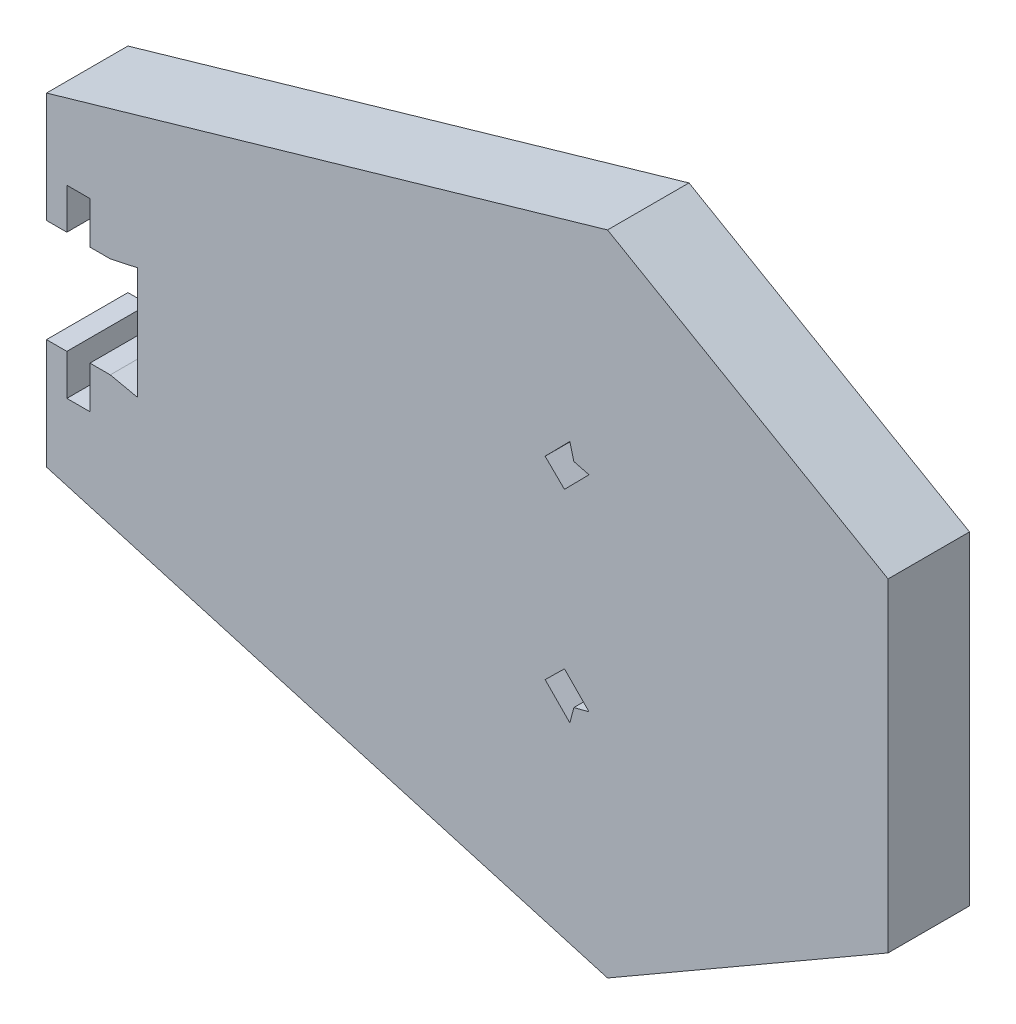
ISO-10303-21;
HEADER;
FILE_DESCRIPTION(('STEP AP214'),'2;1');
FILE_NAME('part.step','',(''),(''),'','','');
FILE_SCHEMA(('AUTOMOTIVE_DESIGN { 1 0 10303 214 1 1 1 1 }'));
ENDSEC;
DATA;
#1=APPLICATION_CONTEXT('core data for automotive mechanical design processes');
#2=APPLICATION_PROTOCOL_DEFINITION('international standard','automotive_design',2000,#1);
#3=PRODUCT_CONTEXT('',#1,'mechanical');
#4=PRODUCT('Part','Part','',(#3));
#5=PRODUCT_RELATED_PRODUCT_CATEGORY('part','',(#4));
#6=PRODUCT_DEFINITION_FORMATION('','',#4);
#7=PRODUCT_DEFINITION_CONTEXT('part definition',#1,'design');
#8=PRODUCT_DEFINITION('design','',#6,#7);
#9=PRODUCT_DEFINITION_SHAPE('','',#8);
#10=(LENGTH_UNIT() NAMED_UNIT(*) SI_UNIT(.MILLI.,.METRE.));
#11=(NAMED_UNIT(*) PLANE_ANGLE_UNIT() SI_UNIT($,.RADIAN.));
#12=(NAMED_UNIT(*) SI_UNIT($,.STERADIAN.) SOLID_ANGLE_UNIT());
#13=UNCERTAINTY_MEASURE_WITH_UNIT(LENGTH_MEASURE(1.E-05),#10,'distance_accuracy_value','');
#14=(GEOMETRIC_REPRESENTATION_CONTEXT(3) GLOBAL_UNCERTAINTY_ASSIGNED_CONTEXT((#13)) GLOBAL_UNIT_ASSIGNED_CONTEXT((#10,
#11,#12)) REPRESENTATION_CONTEXT('',''));
#15=CARTESIAN_POINT('',(0.,0.,0.));
#16=DIRECTION('',(0.,0.,1.));
#17=DIRECTION('',(1.,0.,0.));
#18=AXIS2_PLACEMENT_3D('',#15,#16,#17);
#19=CARTESIAN_POINT('',(-3.26682362399667,3.21868149985037,6.));
#20=DIRECTION('',(0.712336033670005,-0.701838567717168,0.));
#21=DIRECTION('',(0.701838567717168,0.712336033670005,0.));
#22=AXIS2_PLACEMENT_3D('',#19,#20,#21);
#23=PLANE('',#22);
#24=DIRECTION('',(-0.701838567717168,-0.712336033670005,0.));
#25=VECTOR('',#24,1.);
#26=CARTESIAN_POINT('',(-3.26682362399667,3.21868149985037,0.));
#27=LINE('',#26,#25);
#28=CARTESIAN_POINT('',(2.4087145761827,8.97910926261704,0.));
#29=VERTEX_POINT('',#28);
#30=CARTESIAN_POINT('',(0.584447895170022,7.12755685201684,0.));
#31=VERTEX_POINT('',#30);
#32=EDGE_CURVE('E399',#29,#31,#27,.T.);
#33=ORIENTED_EDGE('',*,*,#32,.F.);
#34=DIRECTION('',(0.,0.,-1.));
#35=VECTOR('',#34,1.);
#36=CARTESIAN_POINT('',(2.4087145761827,8.97910926261704,6.));
#37=LINE('',#36,#35);
#38=CARTESIAN_POINT('',(2.4087145761827,8.97910926261704,6.));
#39=VERTEX_POINT('',#38);
#40=EDGE_CURVE('E422',#39,#29,#37,.T.);
#41=ORIENTED_EDGE('',*,*,#40,.F.);
#42=DIRECTION('',(-0.701838567717168,-0.712336033670005,0.));
#43=VECTOR('',#42,1.);
#44=CARTESIAN_POINT('',(-3.26682362399667,3.21868149985037,6.));
#45=LINE('',#44,#43);
#46=CARTESIAN_POINT('',(0.584447895170022,7.12755685201684,6.));
#47=VERTEX_POINT('',#46);
#48=EDGE_CURVE('E343',#39,#47,#45,.T.);
#49=ORIENTED_EDGE('',*,*,#48,.T.);
#50=DIRECTION('',(0.,0.,-1.));
#51=VECTOR('',#50,1.);
#52=CARTESIAN_POINT('',(0.584447895170022,7.12755685201684,6.));
#53=LINE('',#52,#51);
#54=EDGE_CURVE('E413',#47,#31,#53,.T.);
#55=ORIENTED_EDGE('',*,*,#54,.T.);
#56=EDGE_LOOP('',(#33,#41,#49,#55));
#57=FACE_BOUND('',#56,.T.);
#58=ADVANCED_FACE('F35',(#57),#23,.T.);
#59=CARTESIAN_POINT('',(4.43325491605289,1.14578469708355,6.));
#60=DIRECTION('',(-0.968186432146917,-0.250229959450548,0.));
#61=DIRECTION('',(0.250229959450548,-0.968186432146917,0.));
#62=AXIS2_PLACEMENT_3D('',#59,#60,#61);
#63=PLANE('',#62);
#64=DIRECTION('',(-0.250229959450548,0.968186432146917,0.));
#65=VECTOR('',#64,1.);
#66=CARTESIAN_POINT('',(4.43325491605289,1.14578469708355,0.));
#67=LINE('',#66,#65);
#68=CARTESIAN_POINT('',(2.7004254455055,7.85042544550625,0.));
#69=VERTEX_POINT('',#68);
#70=EDGE_CURVE('E402',#69,#29,#67,.T.);
#71=ORIENTED_EDGE('',*,*,#70,.F.);
#72=DIRECTION('',(0.,0.,-1.));
#73=VECTOR('',#72,1.);
#74=CARTESIAN_POINT('',(2.7004254455055,7.85042544550625,6.));
#75=LINE('',#74,#73);
#76=CARTESIAN_POINT('',(2.7004254455055,7.85042544550625,6.));
#77=VERTEX_POINT('',#76);
#78=EDGE_CURVE('E420',#77,#69,#75,.T.);
#79=ORIENTED_EDGE('',*,*,#78,.F.);
#80=DIRECTION('',(-0.250229959450548,0.968186432146917,0.));
#81=VECTOR('',#80,1.);
#82=CARTESIAN_POINT('',(4.43325491605289,1.14578469708355,6.));
#83=LINE('',#82,#81);
#84=EDGE_CURVE('E346',#77,#39,#83,.T.);
#85=ORIENTED_EDGE('',*,*,#84,.T.);
#86=ORIENTED_EDGE('',*,*,#40,.T.);
#87=EDGE_LOOP('',(#71,#79,#85,#86));
#88=FACE_BOUND('',#87,.T.);
#89=ADVANCED_FACE('F546',(#88),#63,.T.);
#90=CARTESIAN_POINT('',(2.07100392519156,8.01310085209733,6.));
#91=DIRECTION('',(-0.250229959450549,-0.968186432146917,0.));
#92=DIRECTION('',(0.968186432146917,-0.250229959450549,0.));
#93=AXIS2_PLACEMENT_3D('',#90,#91,#92);
#94=PLANE('',#93);
#95=DIRECTION('',(-0.968186432146917,0.250229959450549,0.));
#96=VECTOR('',#95,1.);
#97=CARTESIAN_POINT('',(2.07100392519156,8.01310085209733,0.));
#98=LINE('',#97,#96);
#99=CARTESIAN_POINT('',(3.81927842247489,7.56125537891345,0.));
#100=VERTEX_POINT('',#99);
#101=EDGE_CURVE('E405',#100,#69,#98,.T.);
#102=ORIENTED_EDGE('',*,*,#101,.F.);
#103=DIRECTION('',(0.,0.,-1.));
#104=VECTOR('',#103,1.);
#105=CARTESIAN_POINT('',(3.81927842247489,7.56125537891345,6.));
#106=LINE('',#105,#104);
#107=CARTESIAN_POINT('',(3.81927842247489,7.56125537891345,6.));
#108=VERTEX_POINT('',#107);
#109=EDGE_CURVE('E418',#108,#100,#106,.T.);
#110=ORIENTED_EDGE('',*,*,#109,.F.);
#111=DIRECTION('',(-0.968186432146917,0.250229959450549,0.));
#112=VECTOR('',#111,1.);
#113=CARTESIAN_POINT('',(2.07100392519156,8.01310085209733,6.));
#114=LINE('',#113,#112);
#115=EDGE_CURVE('E349',#108,#77,#114,.T.);
#116=ORIENTED_EDGE('',*,*,#115,.T.);
#117=ORIENTED_EDGE('',*,*,#78,.T.);
#118=EDGE_LOOP('',(#102,#110,#116,#117));
#119=FACE_BOUND('',#118,.T.);
#120=ADVANCED_FACE('F552',(#119),#94,.T.);
#121=CARTESIAN_POINT('',(-1.84222279419438,1.81507455214917,6.));
#122=DIRECTION('',(-0.712336033670005,0.701838567717168,0.));
#123=DIRECTION('',(-0.701838567717168,-0.712336033670005,0.));
#124=AXIS2_PLACEMENT_3D('',#121,#122,#123);
#125=PLANE('',#124);
#126=DIRECTION('',(0.701838567717168,0.712336033670005,0.));
#127=VECTOR('',#126,1.);
#128=CARTESIAN_POINT('',(-1.84222279419438,1.81507455214917,0.));
#129=LINE('',#128,#127);
#130=CARTESIAN_POINT('',(2.00904872497232,5.72394990431564,0.));
#131=VERTEX_POINT('',#130);
#132=EDGE_CURVE('E408',#131,#100,#129,.T.);
#133=ORIENTED_EDGE('',*,*,#132,.F.);
#134=DIRECTION('',(0.,0.,-1.));
#135=VECTOR('',#134,1.);
#136=CARTESIAN_POINT('',(2.00904872497232,5.72394990431564,6.));
#137=LINE('',#136,#135);
#138=CARTESIAN_POINT('',(2.00904872497232,5.72394990431564,6.));
#139=VERTEX_POINT('',#138);
#140=EDGE_CURVE('E415',#139,#131,#137,.T.);
#141=ORIENTED_EDGE('',*,*,#140,.F.);
#142=DIRECTION('',(0.701838567717168,0.712336033670005,0.));
#143=VECTOR('',#142,1.);
#144=CARTESIAN_POINT('',(-1.84222279419438,1.81507455214917,6.));
#145=LINE('',#144,#143);
#146=EDGE_CURVE('E352',#139,#108,#145,.T.);
#147=ORIENTED_EDGE('',*,*,#146,.T.);
#148=ORIENTED_EDGE('',*,*,#109,.T.);
#149=EDGE_LOOP('',(#133,#141,#147,#148));
#150=FACE_BOUND('',#149,.T.);
#151=ADVANCED_FACE('F577',(#150),#125,.T.);
#152=CARTESIAN_POINT('',(2.07100392519156,-8.01310085209733,6.));
#153=DIRECTION('',(0.250229959450549,-0.968186432146917,0.));
#154=DIRECTION('',(0.968186432146917,0.250229959450549,0.));
#155=AXIS2_PLACEMENT_3D('',#152,#153,#154);
#156=PLANE('',#155);
#157=DIRECTION('',(-0.968186432146917,-0.250229959450549,0.));
#158=VECTOR('',#157,1.);
#159=CARTESIAN_POINT('',(2.07100392519156,-8.01310085209733,0.));
#160=LINE('',#159,#158);
#161=CARTESIAN_POINT('',(3.81927842247489,-7.56125537891345,0.));
#162=VERTEX_POINT('',#161);
#163=CARTESIAN_POINT('',(2.7004254455055,-7.85042544550625,0.));
#164=VERTEX_POINT('',#163);
#165=EDGE_CURVE('E388',#162,#164,#160,.T.);
#166=ORIENTED_EDGE('',*,*,#165,.T.);
#167=DIRECTION('',(0.,0.,-1.));
#168=VECTOR('',#167,1.);
#169=CARTESIAN_POINT('',(2.7004254455055,-7.85042544550625,6.));
#170=LINE('',#169,#168);
#171=CARTESIAN_POINT('',(2.7004254455055,-7.85042544550625,6.));
#172=VERTEX_POINT('',#171);
#173=EDGE_CURVE('E416',#172,#164,#170,.T.);
#174=ORIENTED_EDGE('',*,*,#173,.F.);
#175=DIRECTION('',(-0.968186432146917,-0.250229959450549,0.));
#176=VECTOR('',#175,1.);
#177=CARTESIAN_POINT('',(2.07100392519156,-8.01310085209733,6.));
#178=LINE('',#177,#176);
#179=CARTESIAN_POINT('',(3.81927842247489,-7.56125537891345,6.));
#180=VERTEX_POINT('',#179);
#181=EDGE_CURVE('E332',#180,#172,#178,.T.);
#182=ORIENTED_EDGE('',*,*,#181,.F.);
#183=DIRECTION('',(0.,0.,-1.));
#184=VECTOR('',#183,1.);
#185=CARTESIAN_POINT('',(3.81927842247489,-7.56125537891345,6.));
#186=LINE('',#185,#184);
#187=EDGE_CURVE('E424',#180,#162,#186,.T.);
#188=ORIENTED_EDGE('',*,*,#187,.T.);
#189=EDGE_LOOP('',(#166,#174,#182,#188));
#190=FACE_BOUND('',#189,.T.);
#191=ADVANCED_FACE('F573',(#190),#156,.F.);
#192=CARTESIAN_POINT('',(4.43325491605289,-1.14578469708355,6.));
#193=DIRECTION('',(0.968186432146917,-0.250229959450548,0.));
#194=DIRECTION('',(0.250229959450548,0.968186432146917,0.));
#195=AXIS2_PLACEMENT_3D('',#192,#193,#194);
#196=PLANE('',#195);
#197=DIRECTION('',(-0.250229959450548,-0.968186432146917,0.));
#198=VECTOR('',#197,1.);
#199=CARTESIAN_POINT('',(4.43325491605289,-1.14578469708355,0.));
#200=LINE('',#199,#198);
#201=CARTESIAN_POINT('',(2.4087145761827,-8.97910926261704,0.));
#202=VERTEX_POINT('',#201);
#203=EDGE_CURVE('E391',#164,#202,#200,.T.);
#204=ORIENTED_EDGE('',*,*,#203,.T.);
#205=DIRECTION('',(0.,0.,-1.));
#206=VECTOR('',#205,1.);
#207=CARTESIAN_POINT('',(2.4087145761827,-8.97910926261704,6.));
#208=LINE('',#207,#206);
#209=CARTESIAN_POINT('',(2.4087145761827,-8.97910926261704,6.));
#210=VERTEX_POINT('',#209);
#211=EDGE_CURVE('E434',#210,#202,#208,.T.);
#212=ORIENTED_EDGE('',*,*,#211,.F.);
#213=DIRECTION('',(-0.250229959450548,-0.968186432146917,0.));
#214=VECTOR('',#213,1.);
#215=CARTESIAN_POINT('',(4.43325491605289,-1.14578469708355,6.));
#216=LINE('',#215,#214);
#217=EDGE_CURVE('E335',#172,#210,#216,.T.);
#218=ORIENTED_EDGE('',*,*,#217,.F.);
#219=ORIENTED_EDGE('',*,*,#173,.T.);
#220=EDGE_LOOP('',(#204,#212,#218,#219));
#221=FACE_BOUND('',#220,.T.);
#222=ADVANCED_FACE('F569',(#221),#196,.F.);
#223=CARTESIAN_POINT('',(-3.26682362399667,-3.21868149985037,6.));
#224=DIRECTION('',(-0.712336033670005,-0.701838567717168,0.));
#225=DIRECTION('',(0.701838567717168,-0.712336033670005,0.));
#226=AXIS2_PLACEMENT_3D('',#223,#224,#225);
#227=PLANE('',#226);
#228=DIRECTION('',(-0.701838567717168,0.712336033670005,0.));
#229=VECTOR('',#228,1.);
#230=CARTESIAN_POINT('',(-3.26682362399667,-3.21868149985037,0.));
#231=LINE('',#230,#229);
#232=CARTESIAN_POINT('',(0.584447895170024,-7.12755685201684,0.));
#233=VERTEX_POINT('',#232);
#234=EDGE_CURVE('E393',#202,#233,#231,.T.);
#235=ORIENTED_EDGE('',*,*,#234,.T.);
#236=DIRECTION('',(0.,0.,-1.));
#237=VECTOR('',#236,1.);
#238=CARTESIAN_POINT('',(0.584447895170024,-7.12755685201684,6.));
#239=LINE('',#238,#237);
#240=CARTESIAN_POINT('',(0.584447895170024,-7.12755685201684,6.));
#241=VERTEX_POINT('',#240);
#242=EDGE_CURVE('E431',#241,#233,#239,.T.);
#243=ORIENTED_EDGE('',*,*,#242,.F.);
#244=DIRECTION('',(-0.701838567717168,0.712336033670005,0.));
#245=VECTOR('',#244,1.);
#246=CARTESIAN_POINT('',(-3.26682362399667,-3.21868149985037,6.));
#247=LINE('',#246,#245);
#248=EDGE_CURVE('E337',#210,#241,#247,.T.);
#249=ORIENTED_EDGE('',*,*,#248,.F.);
#250=ORIENTED_EDGE('',*,*,#211,.T.);
#251=EDGE_LOOP('',(#235,#243,#249,#250));
#252=FACE_BOUND('',#251,.T.);
#253=ADVANCED_FACE('F565',(#252),#227,.F.);
#254=CARTESIAN_POINT('',(3.8512715191667,-3.90887535216647,6.));
#255=DIRECTION('',(-0.701838567717168,0.712336033670004,0.));
#256=DIRECTION('',(-0.712336033670004,-0.701838567717168,0.));
#257=AXIS2_PLACEMENT_3D('',#254,#255,#256);
#258=PLANE('',#257);
#259=DIRECTION('',(0.712336033670004,0.701838567717168,0.));
#260=VECTOR('',#259,1.);
#261=CARTESIAN_POINT('',(3.8512715191667,-3.90887535216647,0.));
#262=LINE('',#261,#260);
#263=CARTESIAN_POINT('',(2.00904872497232,-5.72394990431564,0.));
#264=VERTEX_POINT('',#263);
#265=EDGE_CURVE('E395',#233,#264,#262,.T.);
#266=ORIENTED_EDGE('',*,*,#265,.T.);
#267=DIRECTION('',(0.,0.,-1.));
#268=VECTOR('',#267,1.);
#269=CARTESIAN_POINT('',(2.00904872497232,-5.72394990431564,6.));
#270=LINE('',#269,#268);
#271=CARTESIAN_POINT('',(2.00904872497232,-5.72394990431564,6.));
#272=VERTEX_POINT('',#271);
#273=EDGE_CURVE('E427',#272,#264,#270,.T.);
#274=ORIENTED_EDGE('',*,*,#273,.F.);
#275=DIRECTION('',(0.712336033670004,0.701838567717168,0.));
#276=VECTOR('',#275,1.);
#277=CARTESIAN_POINT('',(3.8512715191667,-3.90887535216647,6.));
#278=LINE('',#277,#276);
#279=EDGE_CURVE('E339',#241,#272,#278,.T.);
#280=ORIENTED_EDGE('',*,*,#279,.F.);
#281=ORIENTED_EDGE('',*,*,#242,.T.);
#282=EDGE_LOOP('',(#266,#274,#280,#281));
#283=FACE_BOUND('',#282,.T.);
#284=ADVANCED_FACE('F562',(#283),#258,.F.);
#285=CARTESIAN_POINT('',(25.8499999999996,0.,6.));
#286=DIRECTION('',(-1.,0.,0.));
#287=DIRECTION('',(0.,0.,1.));
#288=AXIS2_PLACEMENT_3D('',#285,#286,#287);
#289=PLANE('',#288);
#290=DIRECTION('',(0.,1.,0.));
#291=VECTOR('',#290,1.);
#292=CARTESIAN_POINT('',(25.8499999999996,0.,0.));
#293=LINE('',#292,#291);
#294=CARTESIAN_POINT('',(25.8499999999996,-11.9319055632524,0.));
#295=VERTEX_POINT('',#294);
#296=CARTESIAN_POINT('',(25.8499999999996,11.9319055632521,0.));
#297=VERTEX_POINT('',#296);
#298=EDGE_CURVE('E301',#295,#297,#293,.T.);
#299=ORIENTED_EDGE('',*,*,#298,.T.);
#300=DIRECTION('',(0.,0.,-1.));
#301=VECTOR('',#300,1.);
#302=CARTESIAN_POINT('',(25.8499999999996,11.9319055632521,6.));
#303=LINE('',#302,#301);
#304=CARTESIAN_POINT('',(25.8499999999996,11.9319055632521,6.));
#305=VERTEX_POINT('',#304);
#306=EDGE_CURVE('E428',#305,#297,#303,.T.);
#307=ORIENTED_EDGE('',*,*,#306,.F.);
#308=DIRECTION('',(0.,1.,0.));
#309=VECTOR('',#308,1.);
#310=CARTESIAN_POINT('',(25.8499999999996,0.,6.));
#311=LINE('',#310,#309);
#312=CARTESIAN_POINT('',(25.8499999999996,-11.9319055632524,6.));
#313=VERTEX_POINT('',#312);
#314=EDGE_CURVE('E302',#313,#305,#311,.T.);
#315=ORIENTED_EDGE('',*,*,#314,.F.);
#316=DIRECTION('',(0.,0.,-1.));
#317=VECTOR('',#316,1.);
#318=CARTESIAN_POINT('',(25.8499999999996,-11.9319055632524,6.));
#319=LINE('',#318,#317);
#320=EDGE_CURVE('E358',#313,#295,#319,.T.);
#321=ORIENTED_EDGE('',*,*,#320,.T.);
#322=EDGE_LOOP('',(#299,#307,#315,#321));
#323=FACE_BOUND('',#322,.T.);
#324=ADVANCED_FACE('F37',(#323),#289,.F.);
#325=CARTESIAN_POINT('',(11.6291666666665,20.1423075163528,6.));
#326=DIRECTION('',(-0.500000000000001,-0.866025403784438,0.));
#327=DIRECTION('',(0.866025403784438,-0.500000000000001,0.));
#328=AXIS2_PLACEMENT_3D('',#325,#326,#327);
#329=PLANE('',#328);
#330=DIRECTION('',(-0.866025403784438,0.500000000000001,0.));
#331=VECTOR('',#330,1.);
#332=CARTESIAN_POINT('',(11.6291666666665,20.1423075163528,0.));
#333=LINE('',#332,#331);
#334=CARTESIAN_POINT('',(5.18333333333297,23.8638111265044,0.));
#335=VERTEX_POINT('',#334);
#336=EDGE_CURVE('E361',#297,#335,#333,.T.);
#337=ORIENTED_EDGE('',*,*,#336,.T.);
#338=DIRECTION('',(0.,0.,-1.));
#339=VECTOR('',#338,1.);
#340=CARTESIAN_POINT('',(5.18333333333297,23.8638111265044,6.));
#341=LINE('',#340,#339);
#342=CARTESIAN_POINT('',(5.18333333333297,23.8638111265044,6.));
#343=VERTEX_POINT('',#342);
#344=EDGE_CURVE('E460',#343,#335,#341,.T.);
#345=ORIENTED_EDGE('',*,*,#344,.F.);
#346=DIRECTION('',(-0.866025403784438,0.500000000000001,0.));
#347=VECTOR('',#346,1.);
#348=CARTESIAN_POINT('',(11.6291666666665,20.1423075163528,6.));
#349=LINE('',#348,#347);
#350=EDGE_CURVE('E305',#305,#343,#349,.T.);
#351=ORIENTED_EDGE('',*,*,#350,.F.);
#352=ORIENTED_EDGE('',*,*,#306,.T.);
#353=EDGE_LOOP('',(#337,#345,#351,#352));
#354=FACE_BOUND('',#353,.T.);
#355=ADVANCED_FACE('F465',(#354),#329,.F.);
#356=CARTESIAN_POINT('',(-5.96025641025639,20.6469338574043,6.));
#357=DIRECTION('',(-0.277350098112614,0.960768922830523,0.));
#358=DIRECTION('',(-0.960768922830523,-0.277350098112614,0.));
#359=AXIS2_PLACEMENT_3D('',#356,#357,#358);
#360=PLANE('',#359);
#361=DIRECTION('',(0.960768922830523,0.277350098112614,0.));
#362=VECTOR('',#361,1.);
#363=CARTESIAN_POINT('',(-5.96025641025639,20.6469338574043,0.));
#364=LINE('',#363,#362);
#365=CARTESIAN_POINT('',(-36.1500000000004,11.9319055632521,0.));
#366=VERTEX_POINT('',#365);
#367=EDGE_CURVE('E364',#366,#335,#364,.T.);
#368=ORIENTED_EDGE('',*,*,#367,.F.);
#369=DIRECTION('',(0.,0.,-1.));
#370=VECTOR('',#369,1.);
#371=CARTESIAN_POINT('',(-36.1500000000004,11.9319055632521,6.));
#372=LINE('',#371,#370);
#373=CARTESIAN_POINT('',(-36.1500000000004,11.9319055632521,6.));
#374=VERTEX_POINT('',#373);
#375=EDGE_CURVE('E458',#374,#366,#372,.T.);
#376=ORIENTED_EDGE('',*,*,#375,.F.);
#377=DIRECTION('',(0.960768922830523,0.277350098112614,0.));
#378=VECTOR('',#377,1.);
#379=CARTESIAN_POINT('',(-5.96025641025639,20.6469338574043,6.));
#380=LINE('',#379,#378);
#381=EDGE_CURVE('E308',#374,#343,#380,.T.);
#382=ORIENTED_EDGE('',*,*,#381,.T.);
#383=ORIENTED_EDGE('',*,*,#344,.T.);
#384=EDGE_LOOP('',(#368,#376,#382,#383));
#385=FACE_BOUND('',#384,.T.);
#386=ADVANCED_FACE('F476',(#385),#360,.T.);
#387=CARTESIAN_POINT('',(-36.1500000000004,0.,6.));
#388=DIRECTION('',(1.,0.,0.));
#389=DIRECTION('',(0.,0.,-1.));
#390=AXIS2_PLACEMENT_3D('',#387,#388,#389);
#391=PLANE('',#390);
#392=DIRECTION('',(0.,-1.,0.));
#393=VECTOR('',#392,1.);
#394=CARTESIAN_POINT('',(-36.1500000000004,0.,0.));
#395=LINE('',#394,#393);
#396=CARTESIAN_POINT('',(-36.1500000000004,3.79999999999954,0.));
#397=VERTEX_POINT('',#396);
#398=EDGE_CURVE('E367',#366,#397,#395,.T.);
#399=ORIENTED_EDGE('',*,*,#398,.T.);
#400=DIRECTION('',(0.,0.,1.));
#401=VECTOR('',#400,1.);
#402=CARTESIAN_POINT('',(-36.1500000000004,3.79999999999954,6.));
#403=LINE('',#402,#401);
#404=CARTESIAN_POINT('',(-36.1500000000004,3.79999999999954,6.));
#405=VERTEX_POINT('',#404);
#406=EDGE_CURVE('E298',#397,#405,#403,.T.);
#407=ORIENTED_EDGE('',*,*,#406,.T.);
#408=DIRECTION('',(0.,-1.,0.));
#409=VECTOR('',#408,1.);
#410=CARTESIAN_POINT('',(-36.1500000000004,0.,6.));
#411=LINE('',#410,#409);
#412=EDGE_CURVE('E311',#374,#405,#411,.T.);
#413=ORIENTED_EDGE('',*,*,#412,.F.);
#414=ORIENTED_EDGE('',*,*,#375,.T.);
#415=EDGE_LOOP('',(#399,#407,#413,#414));
#416=FACE_BOUND('',#415,.T.);
#417=ADVANCED_FACE('F535',(#416),#391,.F.);
#418=CARTESIAN_POINT('',(0.,3.69999999999914,6.));
#419=DIRECTION('',(0.,1.,0.));
#420=DIRECTION('',(-1.,0.,0.));
#421=AXIS2_PLACEMENT_3D('',#418,#419,#420);
#422=PLANE('',#421);
#423=DIRECTION('',(1.,0.,0.));
#424=VECTOR('',#423,1.);
#425=CARTESIAN_POINT('',(0.,3.69999999999914,6.));
#426=LINE('',#425,#424);
#427=CARTESIAN_POINT('',(-32.9500000000007,3.69999999999988,6.));
#428=VERTEX_POINT('',#427);
#429=CARTESIAN_POINT('',(-31.4500000000004,3.69999999999985,6.));
#430=VERTEX_POINT('',#429);
#431=EDGE_CURVE('E314',#428,#430,#426,.T.);
#432=ORIENTED_EDGE('',*,*,#431,.F.);
#433=DIRECTION('',(0.,0.,-1.));
#434=VECTOR('',#433,1.);
#435=CARTESIAN_POINT('',(-32.9500000000007,3.69999999999989,6.));
#436=LINE('',#435,#434);
#437=CARTESIAN_POINT('',(-32.9500000000007,3.69999999999988,0.));
#438=VERTEX_POINT('',#437);
#439=EDGE_CURVE('E295',#428,#438,#436,.T.);
#440=ORIENTED_EDGE('',*,*,#439,.T.);
#441=DIRECTION('',(1.,0.,0.));
#442=VECTOR('',#441,1.);
#443=CARTESIAN_POINT('',(0.,3.69999999999914,0.));
#444=LINE('',#443,#442);
#445=CARTESIAN_POINT('',(-31.4500000000004,3.69999999999985,0.));
#446=VERTEX_POINT('',#445);
#447=EDGE_CURVE('E370',#438,#446,#444,.T.);
#448=ORIENTED_EDGE('',*,*,#447,.T.);
#449=DIRECTION('',(0.,0.,-1.));
#450=VECTOR('',#449,1.);
#451=CARTESIAN_POINT('',(-31.4500000000004,3.69999999999985,6.));
#452=LINE('',#451,#450);
#453=EDGE_CURVE('E455',#430,#446,#452,.T.);
#454=ORIENTED_EDGE('',*,*,#453,.F.);
#455=EDGE_LOOP('',(#432,#440,#448,#454));
#456=FACE_BOUND('',#455,.T.);
#457=ADVANCED_FACE('F522',(#456),#422,.F.);
#458=CARTESIAN_POINT('',(-2.16647369502472,10.0270709570905,6.));
#459=DIRECTION('',(-0.211189221291749,0.977445196832121,0.));
#460=DIRECTION('',(-0.977445196832122,-0.211189221291749,0.));
#461=AXIS2_PLACEMENT_3D('',#458,#459,#460);
#462=PLANE('',#461);
#463=DIRECTION('',(0.977445196832121,0.211189221291749,0.));
#464=VECTOR('',#463,1.);
#465=CARTESIAN_POINT('',(-2.16647369502472,10.0270709570905,0.));
#466=LINE('',#465,#464);
#467=CARTESIAN_POINT('',(-29.4500000000004,4.13212493544628,0.));
#468=VERTEX_POINT('',#467);
#469=EDGE_CURVE('E372',#446,#468,#466,.T.);
#470=ORIENTED_EDGE('',*,*,#469,.T.);
#471=DIRECTION('',(0.,0.,-1.));
#472=VECTOR('',#471,1.);
#473=CARTESIAN_POINT('',(-29.4500000000004,4.13212493544628,6.));
#474=LINE('',#473,#472);
#475=CARTESIAN_POINT('',(-29.4500000000004,4.13212493544628,6.));
#476=VERTEX_POINT('',#475);
#477=EDGE_CURVE('E452',#476,#468,#474,.T.);
#478=ORIENTED_EDGE('',*,*,#477,.F.);
#479=DIRECTION('',(0.977445196832121,0.211189221291749,0.));
#480=VECTOR('',#479,1.);
#481=CARTESIAN_POINT('',(-2.16647369502472,10.0270709570905,6.));
#482=LINE('',#481,#480);
#483=EDGE_CURVE('E316',#430,#476,#482,.T.);
#484=ORIENTED_EDGE('',*,*,#483,.F.);
#485=ORIENTED_EDGE('',*,*,#453,.T.);
#486=EDGE_LOOP('',(#470,#478,#484,#485));
#487=FACE_BOUND('',#486,.T.);
#488=ADVANCED_FACE('F517',(#487),#462,.F.);
#489=CARTESIAN_POINT('',(-29.4500000000004,0.,6.));
#490=DIRECTION('',(1.,0.,0.));
#491=DIRECTION('',(0.,0.,-1.));
#492=AXIS2_PLACEMENT_3D('',#489,#490,#491);
#493=PLANE('',#492);
#494=DIRECTION('',(0.,-1.,0.));
#495=VECTOR('',#494,1.);
#496=CARTESIAN_POINT('',(-29.4500000000004,0.,0.));
#497=LINE('',#496,#495);
#498=CARTESIAN_POINT('',(-29.4500000000004,-4.13212493544628,0.));
#499=VERTEX_POINT('',#498);
#500=EDGE_CURVE('E374',#468,#499,#497,.T.);
#501=ORIENTED_EDGE('',*,*,#500,.T.);
#502=DIRECTION('',(0.,0.,-1.));
#503=VECTOR('',#502,1.);
#504=CARTESIAN_POINT('',(-29.4500000000004,-4.13212493544628,6.));
#505=LINE('',#504,#503);
#506=CARTESIAN_POINT('',(-29.4500000000004,-4.13212493544628,6.));
#507=VERTEX_POINT('',#506);
#508=EDGE_CURVE('E449',#507,#499,#505,.T.);
#509=ORIENTED_EDGE('',*,*,#508,.F.);
#510=DIRECTION('',(0.,-1.,0.));
#511=VECTOR('',#510,1.);
#512=CARTESIAN_POINT('',(-29.4500000000004,0.,6.));
#513=LINE('',#512,#511);
#514=EDGE_CURVE('E318',#476,#507,#513,.T.);
#515=ORIENTED_EDGE('',*,*,#514,.F.);
#516=ORIENTED_EDGE('',*,*,#477,.T.);
#517=EDGE_LOOP('',(#501,#509,#515,#516));
#518=FACE_BOUND('',#517,.T.);
#519=ADVANCED_FACE('F513',(#518),#493,.F.);
#520=CARTESIAN_POINT('',(-2.16647369502473,-10.0270709570905,6.));
#521=DIRECTION('',(-0.211189221291749,-0.977445196832121,0.));
#522=DIRECTION('',(0.977445196832121,-0.211189221291749,0.));
#523=AXIS2_PLACEMENT_3D('',#520,#521,#522);
#524=PLANE('',#523);
#525=DIRECTION('',(-0.977445196832121,0.211189221291749,0.));
#526=VECTOR('',#525,1.);
#527=CARTESIAN_POINT('',(-2.16647369502473,-10.0270709570905,0.));
#528=LINE('',#527,#526);
#529=CARTESIAN_POINT('',(-31.4500000000004,-3.69999999999985,0.));
#530=VERTEX_POINT('',#529);
#531=EDGE_CURVE('E376',#499,#530,#528,.T.);
#532=ORIENTED_EDGE('',*,*,#531,.T.);
#533=DIRECTION('',(0.,0.,-1.));
#534=VECTOR('',#533,1.);
#535=CARTESIAN_POINT('',(-31.4500000000004,-3.69999999999985,6.));
#536=LINE('',#535,#534);
#537=CARTESIAN_POINT('',(-31.4500000000004,-3.69999999999985,6.));
#538=VERTEX_POINT('',#537);
#539=EDGE_CURVE('E446',#538,#530,#536,.T.);
#540=ORIENTED_EDGE('',*,*,#539,.F.);
#541=DIRECTION('',(-0.977445196832121,0.211189221291749,0.));
#542=VECTOR('',#541,1.);
#543=CARTESIAN_POINT('',(-2.16647369502473,-10.0270709570905,6.));
#544=LINE('',#543,#542);
#545=EDGE_CURVE('E320',#507,#538,#544,.T.);
#546=ORIENTED_EDGE('',*,*,#545,.F.);
#547=ORIENTED_EDGE('',*,*,#508,.T.);
#548=EDGE_LOOP('',(#532,#540,#546,#547));
#549=FACE_BOUND('',#548,.T.);
#550=ADVANCED_FACE('F508',(#549),#524,.F.);
#551=CARTESIAN_POINT('',(0.,-3.69999999999913,6.));
#552=DIRECTION('',(0.,-1.,0.));
#553=DIRECTION('',(1.,0.,0.));
#554=AXIS2_PLACEMENT_3D('',#551,#552,#553);
#555=PLANE('',#554);
#556=DIRECTION('',(-1.,0.,0.));
#557=VECTOR('',#556,1.);
#558=CARTESIAN_POINT('',(0.,-3.69999999999913,0.));
#559=LINE('',#558,#557);
#560=CARTESIAN_POINT('',(-32.9500000000007,-3.69999999999988,0.));
#561=VERTEX_POINT('',#560);
#562=EDGE_CURVE('E378',#530,#561,#559,.T.);
#563=ORIENTED_EDGE('',*,*,#562,.T.);
#564=DIRECTION('',(0.,0.,1.));
#565=VECTOR('',#564,1.);
#566=CARTESIAN_POINT('',(-32.9500000000007,-3.69999999999989,6.));
#567=LINE('',#566,#565);
#568=CARTESIAN_POINT('',(-32.9500000000007,-3.69999999999988,6.));
#569=VERTEX_POINT('',#568);
#570=EDGE_CURVE('E292',#561,#569,#567,.T.);
#571=ORIENTED_EDGE('',*,*,#570,.T.);
#572=DIRECTION('',(-1.,0.,0.));
#573=VECTOR('',#572,1.);
#574=CARTESIAN_POINT('',(0.,-3.69999999999913,6.));
#575=LINE('',#574,#573);
#576=EDGE_CURVE('E322',#538,#569,#575,.T.);
#577=ORIENTED_EDGE('',*,*,#576,.F.);
#578=ORIENTED_EDGE('',*,*,#539,.T.);
#579=EDGE_LOOP('',(#563,#571,#577,#578));
#580=FACE_BOUND('',#579,.T.);
#581=ADVANCED_FACE('F501',(#580),#555,.F.);
#582=CARTESIAN_POINT('',(-36.1500000000004,0.,6.));
#583=DIRECTION('',(1.,0.,0.));
#584=DIRECTION('',(0.,0.,-1.));
#585=AXIS2_PLACEMENT_3D('',#582,#583,#584);
#586=PLANE('',#585);
#587=DIRECTION('',(0.,-1.,0.));
#588=VECTOR('',#587,1.);
#589=CARTESIAN_POINT('',(-36.1500000000004,0.,6.));
#590=LINE('',#589,#588);
#591=CARTESIAN_POINT('',(-36.1500000000004,-3.80000000000046,6.));
#592=VERTEX_POINT('',#591);
#593=CARTESIAN_POINT('',(-36.1500000000004,-11.9319055632524,6.));
#594=VERTEX_POINT('',#593);
#595=EDGE_CURVE('E325',#592,#594,#590,.T.);
#596=ORIENTED_EDGE('',*,*,#595,.F.);
#597=DIRECTION('',(0.,0.,-1.));
#598=VECTOR('',#597,1.);
#599=CARTESIAN_POINT('',(-36.1500000000004,-3.80000000000046,6.));
#600=LINE('',#599,#598);
#601=CARTESIAN_POINT('',(-36.1500000000004,-3.80000000000046,0.));
#602=VERTEX_POINT('',#601);
#603=EDGE_CURVE('E283',#592,#602,#600,.T.);
#604=ORIENTED_EDGE('',*,*,#603,.T.);
#605=DIRECTION('',(0.,-1.,0.));
#606=VECTOR('',#605,1.);
#607=CARTESIAN_POINT('',(-36.1500000000004,0.,0.));
#608=LINE('',#607,#606);
#609=CARTESIAN_POINT('',(-36.1500000000004,-11.9319055632524,0.));
#610=VERTEX_POINT('',#609);
#611=EDGE_CURVE('E381',#602,#610,#608,.T.);
#612=ORIENTED_EDGE('',*,*,#611,.T.);
#613=DIRECTION('',(0.,0.,-1.));
#614=VECTOR('',#613,1.);
#615=CARTESIAN_POINT('',(-36.1500000000004,-11.9319055632524,6.));
#616=LINE('',#615,#614);
#617=EDGE_CURVE('E443',#594,#610,#616,.T.);
#618=ORIENTED_EDGE('',*,*,#617,.F.);
#619=EDGE_LOOP('',(#596,#604,#612,#618));
#620=FACE_BOUND('',#619,.T.);
#621=ADVANCED_FACE('F492',(#620),#586,.F.);
#622=CARTESIAN_POINT('',(-5.96025641025647,-20.6469338574046,6.));
#623=DIRECTION('',(-0.277350098112614,-0.960768922830523,0.));
#624=DIRECTION('',(0.960768922830523,-0.277350098112614,0.));
#625=AXIS2_PLACEMENT_3D('',#622,#623,#624);
#626=PLANE('',#625);
#627=DIRECTION('',(-0.960768922830523,0.277350098112614,0.));
#628=VECTOR('',#627,1.);
#629=CARTESIAN_POINT('',(-5.96025641025647,-20.6469338574046,0.));
#630=LINE('',#629,#628);
#631=CARTESIAN_POINT('',(5.18333333333297,-23.8638111265047,0.));
#632=VERTEX_POINT('',#631);
#633=EDGE_CURVE('E383',#632,#610,#630,.T.);
#634=ORIENTED_EDGE('',*,*,#633,.F.);
#635=DIRECTION('',(0.,0.,-1.));
#636=VECTOR('',#635,1.);
#637=CARTESIAN_POINT('',(5.18333333333297,-23.8638111265047,6.));
#638=LINE('',#637,#636);
#639=CARTESIAN_POINT('',(5.18333333333297,-23.8638111265047,6.));
#640=VERTEX_POINT('',#639);
#641=EDGE_CURVE('E441',#640,#632,#638,.T.);
#642=ORIENTED_EDGE('',*,*,#641,.F.);
#643=DIRECTION('',(-0.960768922830523,0.277350098112614,0.));
#644=VECTOR('',#643,1.);
#645=CARTESIAN_POINT('',(-5.96025641025647,-20.6469338574046,6.));
#646=LINE('',#645,#644);
#647=EDGE_CURVE('E327',#640,#594,#646,.T.);
#648=ORIENTED_EDGE('',*,*,#647,.T.);
#649=ORIENTED_EDGE('',*,*,#617,.T.);
#650=EDGE_LOOP('',(#634,#642,#648,#649));
#651=FACE_BOUND('',#650,.T.);
#652=ADVANCED_FACE('F488',(#651),#626,.T.);
#653=CARTESIAN_POINT('',(-1.84222279419438,-1.81507455214917,6.));
#654=DIRECTION('',(0.712336033670005,0.701838567717168,0.));
#655=DIRECTION('',(-0.701838567717168,0.712336033670005,0.));
#656=AXIS2_PLACEMENT_3D('',#653,#654,#655);
#657=PLANE('',#656);
#658=DIRECTION('',(0.701838567717168,-0.712336033670005,0.));
#659=VECTOR('',#658,1.);
#660=CARTESIAN_POINT('',(-1.84222279419438,-1.81507455214917,0.));
#661=LINE('',#660,#659);
#662=EDGE_CURVE('E397',#264,#162,#661,.T.);
#663=ORIENTED_EDGE('',*,*,#662,.T.);
#664=ORIENTED_EDGE('',*,*,#187,.F.);
#665=DIRECTION('',(0.701838567717168,-0.712336033670005,0.));
#666=VECTOR('',#665,1.);
#667=CARTESIAN_POINT('',(-1.84222279419438,-1.81507455214917,6.));
#668=LINE('',#667,#666);
#669=EDGE_CURVE('E341',#272,#180,#668,.T.);
#670=ORIENTED_EDGE('',*,*,#669,.F.);
#671=ORIENTED_EDGE('',*,*,#273,.T.);
#672=EDGE_LOOP('',(#663,#664,#670,#671));
#673=FACE_BOUND('',#672,.T.);
#674=ADVANCED_FACE('F558',(#673),#657,.F.);
#675=CARTESIAN_POINT('',(11.6291666666667,-20.142307516353,6.));
#676=DIRECTION('',(-0.500000000000001,0.866025403784438,0.));
#677=DIRECTION('',(-0.866025403784438,-0.500000000000001,0.));
#678=AXIS2_PLACEMENT_3D('',#675,#676,#677);
#679=PLANE('',#678);
#680=DIRECTION('',(0.866025403784438,0.500000000000001,0.));
#681=VECTOR('',#680,1.);
#682=CARTESIAN_POINT('',(11.6291666666667,-20.142307516353,0.));
#683=LINE('',#682,#681);
#684=EDGE_CURVE('E386',#632,#295,#683,.T.);
#685=ORIENTED_EDGE('',*,*,#684,.T.);
#686=ORIENTED_EDGE('',*,*,#320,.F.);
#687=DIRECTION('',(0.866025403784438,0.500000000000001,0.));
#688=VECTOR('',#687,1.);
#689=CARTESIAN_POINT('',(11.6291666666667,-20.142307516353,6.));
#690=LINE('',#689,#688);
#691=EDGE_CURVE('E330',#640,#313,#690,.T.);
#692=ORIENTED_EDGE('',*,*,#691,.F.);
#693=ORIENTED_EDGE('',*,*,#641,.T.);
#694=EDGE_LOOP('',(#685,#686,#692,#693));
#695=FACE_BOUND('',#694,.T.);
#696=ADVANCED_FACE('F486',(#695),#679,.F.);
#697=CARTESIAN_POINT('',(3.8512715191667,3.90887535216647,6.));
#698=DIRECTION('',(0.701838567717168,0.712336033670004,0.));
#699=DIRECTION('',(-0.712336033670004,0.701838567717168,0.));
#700=AXIS2_PLACEMENT_3D('',#697,#698,#699);
#701=PLANE('',#700);
#702=DIRECTION('',(0.712336033670004,-0.701838567717168,0.));
#703=VECTOR('',#702,1.);
#704=CARTESIAN_POINT('',(3.8512715191667,3.90887535216647,0.));
#705=LINE('',#704,#703);
#706=EDGE_CURVE('E306',#31,#131,#705,.T.);
#707=ORIENTED_EDGE('',*,*,#706,.F.);
#708=ORIENTED_EDGE('',*,*,#54,.F.);
#709=DIRECTION('',(0.712336033670004,-0.701838567717168,0.));
#710=VECTOR('',#709,1.);
#711=CARTESIAN_POINT('',(3.8512715191667,3.90887535216647,6.));
#712=LINE('',#711,#710);
#713=EDGE_CURVE('E355',#47,#139,#712,.T.);
#714=ORIENTED_EDGE('',*,*,#713,.T.);
#715=ORIENTED_EDGE('',*,*,#140,.T.);
#716=EDGE_LOOP('',(#707,#708,#714,#715));
#717=FACE_BOUND('',#716,.T.);
#718=ADVANCED_FACE('F581',(#717),#701,.T.);
#719=CARTESIAN_POINT('',(0.,0.,6.));
#720=DIRECTION('',(0.,0.,1.));
#721=DIRECTION('',(1.,0.,0.));
#722=AXIS2_PLACEMENT_3D('',#719,#720,#721);
#723=PLANE('',#722);
#724=DIRECTION('',(-1.,0.,0.));
#725=VECTOR('',#724,1.);
#726=CARTESIAN_POINT('',(-34.6500000000007,3.79999999999954,6.));
#727=LINE('',#726,#725);
#728=CARTESIAN_POINT('',(-34.6500000000007,3.79999999999954,6.));
#729=VERTEX_POINT('',#728);
#730=EDGE_CURVE('E256',#729,#405,#727,.T.);
#731=ORIENTED_EDGE('',*,*,#730,.F.);
#732=DIRECTION('',(0.,-1.,0.));
#733=VECTOR('',#732,1.);
#734=CARTESIAN_POINT('',(-34.6500000000007,6.79999999999955,6.));
#735=LINE('',#734,#733);
#736=CARTESIAN_POINT('',(-34.6500000000007,6.79999999999955,6.));
#737=VERTEX_POINT('',#736);
#738=EDGE_CURVE('E258',#737,#729,#735,.T.);
#739=ORIENTED_EDGE('',*,*,#738,.F.);
#740=DIRECTION('',(-1.,0.,0.));
#741=VECTOR('',#740,1.);
#742=CARTESIAN_POINT('',(-32.9500000000007,6.79999999999955,6.));
#743=LINE('',#742,#741);
#744=CARTESIAN_POINT('',(-32.9500000000007,6.79999999999955,6.));
#745=VERTEX_POINT('',#744);
#746=EDGE_CURVE('E276',#745,#737,#743,.T.);
#747=ORIENTED_EDGE('',*,*,#746,.F.);
#748=DIRECTION('',(0.,1.,0.));
#749=VECTOR('',#748,1.);
#750=CARTESIAN_POINT('',(-32.9500000000007,-6.80000000000046,6.));
#751=LINE('',#750,#749);
#752=EDGE_CURVE('E273',#428,#745,#751,.T.);
#753=ORIENTED_EDGE('',*,*,#752,.F.);
#754=ORIENTED_EDGE('',*,*,#431,.T.);
#755=ORIENTED_EDGE('',*,*,#483,.T.);
#756=ORIENTED_EDGE('',*,*,#514,.T.);
#757=ORIENTED_EDGE('',*,*,#545,.T.);
#758=ORIENTED_EDGE('',*,*,#576,.T.);
#759=CARTESIAN_POINT('',(-32.9500000000007,-6.80000000000046,6.));
#760=VERTEX_POINT('',#759);
#761=EDGE_CURVE('E274',#760,#569,#751,.T.);
#762=ORIENTED_EDGE('',*,*,#761,.F.);
#763=DIRECTION('',(1.,0.,0.));
#764=VECTOR('',#763,1.);
#765=CARTESIAN_POINT('',(-34.6500000000007,-6.80000000000046,6.));
#766=LINE('',#765,#764);
#767=CARTESIAN_POINT('',(-34.6500000000007,-6.80000000000046,6.));
#768=VERTEX_POINT('',#767);
#769=EDGE_CURVE('E271',#768,#760,#766,.T.);
#770=ORIENTED_EDGE('',*,*,#769,.F.);
#771=DIRECTION('',(0.,-1.,0.));
#772=VECTOR('',#771,1.);
#773=CARTESIAN_POINT('',(-34.6500000000007,-3.80000000000046,6.));
#774=LINE('',#773,#772);
#775=CARTESIAN_POINT('',(-34.6500000000007,-3.80000000000046,6.));
#776=VERTEX_POINT('',#775);
#777=EDGE_CURVE('E236',#776,#768,#774,.T.);
#778=ORIENTED_EDGE('',*,*,#777,.F.);
#779=DIRECTION('',(1.,0.,0.));
#780=VECTOR('',#779,1.);
#781=CARTESIAN_POINT('',(-36.2500000000007,-3.80000000000046,6.));
#782=LINE('',#781,#780);
#783=EDGE_CURVE('E268',#592,#776,#782,.T.);
#784=ORIENTED_EDGE('',*,*,#783,.F.);
#785=ORIENTED_EDGE('',*,*,#595,.T.);
#786=ORIENTED_EDGE('',*,*,#647,.F.);
#787=ORIENTED_EDGE('',*,*,#691,.T.);
#788=ORIENTED_EDGE('',*,*,#314,.T.);
#789=ORIENTED_EDGE('',*,*,#350,.T.);
#790=ORIENTED_EDGE('',*,*,#381,.F.);
#791=ORIENTED_EDGE('',*,*,#412,.T.);
#792=EDGE_LOOP('',(#731,#739,#747,#753,#754,#755,#756,#757,#758,#762,#770,#778,#784,#785,#786,
#787,#788,#789,#790,#791));
#793=FACE_BOUND('',#792,.T.);
#794=ORIENTED_EDGE('',*,*,#181,.T.);
#795=ORIENTED_EDGE('',*,*,#217,.T.);
#796=ORIENTED_EDGE('',*,*,#248,.T.);
#797=ORIENTED_EDGE('',*,*,#279,.T.);
#798=ORIENTED_EDGE('',*,*,#669,.T.);
#799=EDGE_LOOP('',(#794,#795,#796,#797,#798));
#800=FACE_BOUND('',#799,.T.);
#801=ORIENTED_EDGE('',*,*,#48,.F.);
#802=ORIENTED_EDGE('',*,*,#84,.F.);
#803=ORIENTED_EDGE('',*,*,#115,.F.);
#804=ORIENTED_EDGE('',*,*,#146,.F.);
#805=ORIENTED_EDGE('',*,*,#713,.F.);
#806=EDGE_LOOP('',(#801,#802,#803,#804,#805));
#807=FACE_BOUND('',#806,.T.);
#808=ADVANCED_FACE('F481',(#793,#800,#807),#723,.T.);
#809=CARTESIAN_POINT('',(0.,0.,0.));
#810=DIRECTION('',(0.,0.,1.));
#811=DIRECTION('',(1.,0.,0.));
#812=AXIS2_PLACEMENT_3D('',#809,#810,#811);
#813=PLANE('',#812);
#814=DIRECTION('',(0.,-1.,0.));
#815=VECTOR('',#814,1.);
#816=CARTESIAN_POINT('',(-34.6500000000007,6.79999999999955,0.));
#817=LINE('',#816,#815);
#818=CARTESIAN_POINT('',(-34.6500000000007,6.79999999999955,0.));
#819=VERTEX_POINT('',#818);
#820=CARTESIAN_POINT('',(-34.6500000000007,3.79999999999954,0.));
#821=VERTEX_POINT('',#820);
#822=EDGE_CURVE('E263',#819,#821,#817,.T.);
#823=ORIENTED_EDGE('',*,*,#822,.T.);
#824=DIRECTION('',(-1.,0.,0.));
#825=VECTOR('',#824,1.);
#826=CARTESIAN_POINT('',(-34.6500000000007,3.79999999999954,0.));
#827=LINE('',#826,#825);
#828=EDGE_CURVE('E265',#821,#397,#827,.T.);
#829=ORIENTED_EDGE('',*,*,#828,.T.);
#830=ORIENTED_EDGE('',*,*,#398,.F.);
#831=ORIENTED_EDGE('',*,*,#367,.T.);
#832=ORIENTED_EDGE('',*,*,#336,.F.);
#833=ORIENTED_EDGE('',*,*,#298,.F.);
#834=ORIENTED_EDGE('',*,*,#684,.F.);
#835=ORIENTED_EDGE('',*,*,#633,.T.);
#836=ORIENTED_EDGE('',*,*,#611,.F.);
#837=DIRECTION('',(1.,0.,0.));
#838=VECTOR('',#837,1.);
#839=CARTESIAN_POINT('',(0.,-3.80000000000046,0.));
#840=LINE('',#839,#838);
#841=CARTESIAN_POINT('',(-34.6500000000007,-3.80000000000046,0.));
#842=VERTEX_POINT('',#841);
#843=EDGE_CURVE('E43',#602,#842,#840,.T.);
#844=ORIENTED_EDGE('',*,*,#843,.T.);
#845=DIRECTION('',(0.,-1.,0.));
#846=VECTOR('',#845,1.);
#847=CARTESIAN_POINT('',(-34.6500000000007,-3.80000000000046,0.));
#848=LINE('',#847,#846);
#849=CARTESIAN_POINT('',(-34.6500000000007,-6.80000000000046,0.));
#850=VERTEX_POINT('',#849);
#851=EDGE_CURVE('E58',#842,#850,#848,.T.);
#852=ORIENTED_EDGE('',*,*,#851,.T.);
#853=DIRECTION('',(1.,0.,0.));
#854=VECTOR('',#853,1.);
#855=CARTESIAN_POINT('',(-34.6500000000007,-6.80000000000046,0.));
#856=LINE('',#855,#854);
#857=CARTESIAN_POINT('',(-32.9500000000007,-6.80000000000046,0.));
#858=VERTEX_POINT('',#857);
#859=EDGE_CURVE('E244',#850,#858,#856,.T.);
#860=ORIENTED_EDGE('',*,*,#859,.T.);
#861=DIRECTION('',(0.,1.,0.));
#862=VECTOR('',#861,1.);
#863=CARTESIAN_POINT('',(-32.9500000000007,-6.80000000000046,0.));
#864=LINE('',#863,#862);
#865=EDGE_CURVE('E249',#858,#561,#864,.T.);
#866=ORIENTED_EDGE('',*,*,#865,.T.);
#867=ORIENTED_EDGE('',*,*,#562,.F.);
#868=ORIENTED_EDGE('',*,*,#531,.F.);
#869=ORIENTED_EDGE('',*,*,#500,.F.);
#870=ORIENTED_EDGE('',*,*,#469,.F.);
#871=ORIENTED_EDGE('',*,*,#447,.F.);
#872=DIRECTION('',(0.,1.,0.));
#873=VECTOR('',#872,1.);
#874=CARTESIAN_POINT('',(-32.9500000000007,0.,0.));
#875=LINE('',#874,#873);
#876=CARTESIAN_POINT('',(-32.9500000000007,6.79999999999955,0.));
#877=VERTEX_POINT('',#876);
#878=EDGE_CURVE('E11',#438,#877,#875,.T.);
#879=ORIENTED_EDGE('',*,*,#878,.T.);
#880=DIRECTION('',(-1.,0.,0.));
#881=VECTOR('',#880,1.);
#882=CARTESIAN_POINT('',(-32.9500000000007,6.79999999999955,0.));
#883=LINE('',#882,#881);
#884=EDGE_CURVE('E50',#877,#819,#883,.T.);
#885=ORIENTED_EDGE('',*,*,#884,.T.);
#886=EDGE_LOOP('',(#823,#829,#830,#831,#832,#833,#834,#835,#836,#844,#852,#860,#866,#867,#868,
#869,#870,#871,#879,#885));
#887=FACE_BOUND('',#886,.T.);
#888=ORIENTED_EDGE('',*,*,#165,.F.);
#889=ORIENTED_EDGE('',*,*,#662,.F.);
#890=ORIENTED_EDGE('',*,*,#265,.F.);
#891=ORIENTED_EDGE('',*,*,#234,.F.);
#892=ORIENTED_EDGE('',*,*,#203,.F.);
#893=EDGE_LOOP('',(#888,#889,#890,#891,#892));
#894=FACE_BOUND('',#893,.T.);
#895=ORIENTED_EDGE('',*,*,#32,.T.);
#896=ORIENTED_EDGE('',*,*,#706,.T.);
#897=ORIENTED_EDGE('',*,*,#132,.T.);
#898=ORIENTED_EDGE('',*,*,#101,.T.);
#899=ORIENTED_EDGE('',*,*,#70,.T.);
#900=EDGE_LOOP('',(#895,#896,#897,#898,#899));
#901=FACE_BOUND('',#900,.T.);
#902=ADVANCED_FACE('F253',(#887,#894,#901),#813,.F.);
#903=CARTESIAN_POINT('',(-36.2500000000007,-3.80000000000046,0.));
#904=DIRECTION('',(0.,-1.,0.));
#905=DIRECTION('',(0.,0.,-1.));
#906=AXIS2_PLACEMENT_3D('',#903,#904,#905);
#907=PLANE('',#906);
#908=ORIENTED_EDGE('',*,*,#783,.T.);
#909=DIRECTION('',(0.,0.,1.));
#910=VECTOR('',#909,1.);
#911=CARTESIAN_POINT('',(-34.6500000000007,-3.80000000000046,0.));
#912=LINE('',#911,#910);
#913=EDGE_CURVE('E241',#842,#776,#912,.T.);
#914=ORIENTED_EDGE('',*,*,#913,.F.);
#915=ORIENTED_EDGE('',*,*,#843,.F.);
#916=ORIENTED_EDGE('',*,*,#603,.F.);
#917=EDGE_LOOP('',(#908,#914,#915,#916));
#918=FACE_BOUND('',#917,.T.);
#919=ADVANCED_FACE('F495',(#918),#907,.F.);
#920=CARTESIAN_POINT('',(-34.6500000000007,-3.80000000000046,0.));
#921=DIRECTION('',(-1.,0.,0.));
#922=DIRECTION('',(0.,0.,1.));
#923=AXIS2_PLACEMENT_3D('',#920,#921,#922);
#924=PLANE('',#923);
#925=ORIENTED_EDGE('',*,*,#777,.T.);
#926=DIRECTION('',(0.,0.,1.));
#927=VECTOR('',#926,1.);
#928=CARTESIAN_POINT('',(-34.6500000000007,-6.80000000000046,0.));
#929=LINE('',#928,#927);
#930=EDGE_CURVE('E232',#850,#768,#929,.T.);
#931=ORIENTED_EDGE('',*,*,#930,.F.);
#932=ORIENTED_EDGE('',*,*,#851,.F.);
#933=ORIENTED_EDGE('',*,*,#913,.T.);
#934=EDGE_LOOP('',(#925,#931,#932,#933));
#935=FACE_BOUND('',#934,.T.);
#936=ADVANCED_FACE('F234',(#935),#924,.F.);
#937=CARTESIAN_POINT('',(-34.6500000000007,-6.80000000000046,0.));
#938=DIRECTION('',(0.,-1.,0.));
#939=DIRECTION('',(0.,0.,-1.));
#940=AXIS2_PLACEMENT_3D('',#937,#938,#939);
#941=PLANE('',#940);
#942=ORIENTED_EDGE('',*,*,#769,.T.);
#943=DIRECTION('',(0.,0.,1.));
#944=VECTOR('',#943,1.);
#945=CARTESIAN_POINT('',(-32.9500000000007,-6.80000000000046,0.));
#946=LINE('',#945,#944);
#947=EDGE_CURVE('E240',#858,#760,#946,.T.);
#948=ORIENTED_EDGE('',*,*,#947,.F.);
#949=ORIENTED_EDGE('',*,*,#859,.F.);
#950=ORIENTED_EDGE('',*,*,#930,.T.);
#951=EDGE_LOOP('',(#942,#948,#949,#950));
#952=FACE_BOUND('',#951,.T.);
#953=ADVANCED_FACE('F245',(#952),#941,.F.);
#954=CARTESIAN_POINT('',(-32.9500000000007,-6.80000000000046,0.));
#955=DIRECTION('',(1.,0.,0.));
#956=DIRECTION('',(0.,0.,-1.));
#957=AXIS2_PLACEMENT_3D('',#954,#955,#956);
#958=PLANE('',#957);
#959=ORIENTED_EDGE('',*,*,#865,.F.);
#960=ORIENTED_EDGE('',*,*,#947,.T.);
#961=ORIENTED_EDGE('',*,*,#761,.T.);
#962=ORIENTED_EDGE('',*,*,#570,.F.);
#963=EDGE_LOOP('',(#959,#960,#961,#962));
#964=FACE_BOUND('',#963,.T.);
#965=ADVANCED_FACE('F499',(#964),#958,.F.);
#966=CARTESIAN_POINT('',(-34.6500000000007,3.79999999999954,0.));
#967=DIRECTION('',(0.,1.,0.));
#968=DIRECTION('',(-1.,0.,0.));
#969=AXIS2_PLACEMENT_3D('',#966,#967,#968);
#970=PLANE('',#969);
#971=ORIENTED_EDGE('',*,*,#828,.F.);
#972=DIRECTION('',(0.,0.,1.));
#973=VECTOR('',#972,1.);
#974=CARTESIAN_POINT('',(-34.6500000000007,3.79999999999954,0.));
#975=LINE('',#974,#973);
#976=EDGE_CURVE('E281',#821,#729,#975,.T.);
#977=ORIENTED_EDGE('',*,*,#976,.T.);
#978=ORIENTED_EDGE('',*,*,#730,.T.);
#979=ORIENTED_EDGE('',*,*,#406,.F.);
#980=EDGE_LOOP('',(#971,#977,#978,#979));
#981=FACE_BOUND('',#980,.T.);
#982=ADVANCED_FACE('F536',(#981),#970,.F.);
#983=ORIENTED_EDGE('',*,*,#752,.T.);
#984=DIRECTION('',(0.,0.,1.));
#985=VECTOR('',#984,1.);
#986=CARTESIAN_POINT('',(-32.9500000000007,6.79999999999955,0.));
#987=LINE('',#986,#985);
#988=EDGE_CURVE('E286',#877,#745,#987,.T.);
#989=ORIENTED_EDGE('',*,*,#988,.F.);
#990=ORIENTED_EDGE('',*,*,#878,.F.);
#991=ORIENTED_EDGE('',*,*,#439,.F.);
#992=EDGE_LOOP('',(#983,#989,#990,#991));
#993=FACE_BOUND('',#992,.T.);
#994=ADVANCED_FACE('F525',(#993),#958,.F.);
#995=CARTESIAN_POINT('',(-34.6500000000007,6.79999999999955,0.));
#996=DIRECTION('',(-1.,0.,0.));
#997=DIRECTION('',(0.,0.,1.));
#998=AXIS2_PLACEMENT_3D('',#995,#996,#997);
#999=PLANE('',#998);
#1000=ORIENTED_EDGE('',*,*,#738,.T.);
#1001=ORIENTED_EDGE('',*,*,#976,.F.);
#1002=ORIENTED_EDGE('',*,*,#822,.F.);
#1003=DIRECTION('',(0.,0.,1.));
#1004=VECTOR('',#1003,1.);
#1005=CARTESIAN_POINT('',(-34.6500000000007,6.79999999999955,0.));
#1006=LINE('',#1005,#1004);
#1007=EDGE_CURVE('E284',#819,#737,#1006,.T.);
#1008=ORIENTED_EDGE('',*,*,#1007,.T.);
#1009=EDGE_LOOP('',(#1000,#1001,#1002,#1008));
#1010=FACE_BOUND('',#1009,.T.);
#1011=ADVANCED_FACE('F531',(#1010),#999,.F.);
#1012=CARTESIAN_POINT('',(-32.9500000000007,6.79999999999955,0.));
#1013=DIRECTION('',(0.,1.,0.));
#1014=DIRECTION('',(0.,0.,1.));
#1015=AXIS2_PLACEMENT_3D('',#1012,#1013,#1014);
#1016=PLANE('',#1015);
#1017=ORIENTED_EDGE('',*,*,#746,.T.);
#1018=ORIENTED_EDGE('',*,*,#1007,.F.);
#1019=ORIENTED_EDGE('',*,*,#884,.F.);
#1020=ORIENTED_EDGE('',*,*,#988,.T.);
#1021=EDGE_LOOP('',(#1017,#1018,#1019,#1020));
#1022=FACE_BOUND('',#1021,.T.);
#1023=ADVANCED_FACE('F528',(#1022),#1016,.F.);
#1024=CLOSED_SHELL('',(#58,#89,#120,#151,#191,#222,#253,#284,#324,#355,#386,#417,#457,#488,#519,
#550,#581,#621,#652,#674,#696,#718,#808,#902,#919,#936,#953,#965,#982,#994,#1011,#1023));
#1025=MANIFOLD_SOLID_BREP('B2',#1024);
#1026=ADVANCED_BREP_SHAPE_REPRESENTATION('',(#18,#1025),#14);
#1027=SHAPE_DEFINITION_REPRESENTATION(#9,#1026);
ENDSEC;
END-ISO-10303-21;
